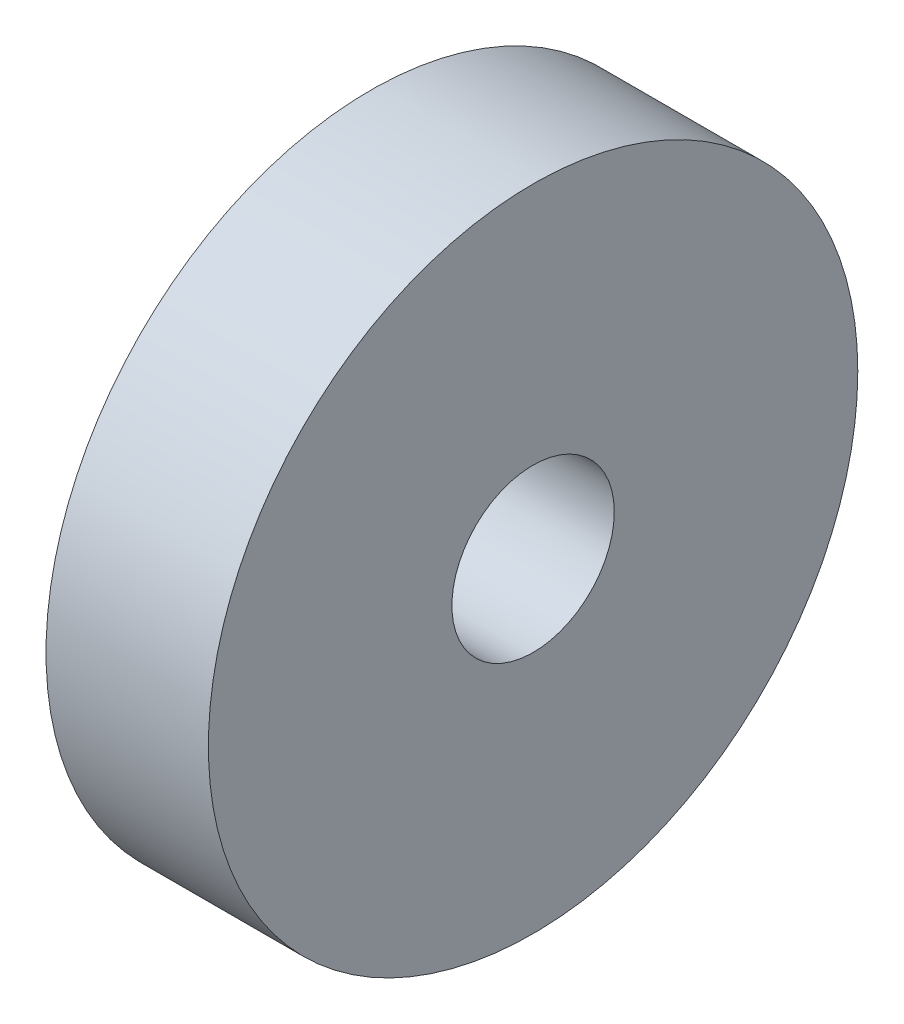
ISO-10303-21;
HEADER;
FILE_DESCRIPTION(('STEP AP214'),'2;1');
FILE_NAME('part.step','',(''),(''),'','','');
FILE_SCHEMA(('AUTOMOTIVE_DESIGN { 1 0 10303 214 1 1 1 1 }'));
ENDSEC;
DATA;
#1=APPLICATION_CONTEXT('core data for automotive mechanical design processes');
#2=APPLICATION_PROTOCOL_DEFINITION('international standard','automotive_design',2000,#1);
#3=PRODUCT_CONTEXT('',#1,'mechanical');
#4=PRODUCT('Part','Part','',(#3));
#5=PRODUCT_RELATED_PRODUCT_CATEGORY('part','',(#4));
#6=PRODUCT_DEFINITION_FORMATION('','',#4);
#7=PRODUCT_DEFINITION_CONTEXT('part definition',#1,'design');
#8=PRODUCT_DEFINITION('design','',#6,#7);
#9=PRODUCT_DEFINITION_SHAPE('','',#8);
#10=(LENGTH_UNIT() NAMED_UNIT(*) SI_UNIT(.MILLI.,.METRE.));
#11=(NAMED_UNIT(*) PLANE_ANGLE_UNIT() SI_UNIT($,.RADIAN.));
#12=(NAMED_UNIT(*) SI_UNIT($,.STERADIAN.) SOLID_ANGLE_UNIT());
#13=UNCERTAINTY_MEASURE_WITH_UNIT(LENGTH_MEASURE(1.E-05),#10,'distance_accuracy_value','');
#14=(GEOMETRIC_REPRESENTATION_CONTEXT(3) GLOBAL_UNCERTAINTY_ASSIGNED_CONTEXT((#13)) GLOBAL_UNIT_ASSIGNED_CONTEXT((#10,
#11,#12)) REPRESENTATION_CONTEXT('',''));
#15=CARTESIAN_POINT('',(0.,0.,0.));
#16=DIRECTION('',(0.,0.,1.));
#17=DIRECTION('',(1.,0.,0.));
#18=AXIS2_PLACEMENT_3D('',#15,#16,#17);
#19=CARTESIAN_POINT('',(-25.,0.,0.));
#20=DIRECTION('',(1.,0.,0.));
#21=DIRECTION('',(0.,0.,-1.));
#22=AXIS2_PLACEMENT_3D('',#19,#20,#21);
#23=CYLINDRICAL_SURFACE('',#22,100.);
#24=CARTESIAN_POINT('',(-25.,0.,0.));
#25=DIRECTION('',(1.,0.,0.));
#26=DIRECTION('',(0.,0.,-1.));
#27=AXIS2_PLACEMENT_3D('',#24,#25,#26);
#28=CIRCLE('',#27,100.);
#29=CARTESIAN_POINT('',(-25.,0.,-100.));
#30=VERTEX_POINT('',#29);
#31=EDGE_CURVE('E10',#30,#30,#28,.T.);
#32=ORIENTED_EDGE('',*,*,#31,.T.);
#33=EDGE_LOOP('',(#32));
#34=FACE_BOUND('',#33,.T.);
#35=CARTESIAN_POINT('',(25.,0.,0.));
#36=DIRECTION('',(1.,0.,0.));
#37=DIRECTION('',(0.,0.,-1.));
#38=AXIS2_PLACEMENT_3D('',#35,#36,#37);
#39=CIRCLE('',#38,100.);
#40=CARTESIAN_POINT('',(25.,0.,-100.));
#41=VERTEX_POINT('',#40);
#42=EDGE_CURVE('E45',#41,#41,#39,.T.);
#43=ORIENTED_EDGE('',*,*,#42,.F.);
#44=EDGE_LOOP('',(#43));
#45=FACE_BOUND('',#44,.T.);
#46=ADVANCED_FACE('F35',(#34,#45),#23,.T.);
#47=CARTESIAN_POINT('',(-25.,0.,0.));
#48=DIRECTION('',(1.,0.,0.));
#49=DIRECTION('',(0.,0.,-1.));
#50=AXIS2_PLACEMENT_3D('',#47,#48,#49);
#51=PLANE('',#50);
#52=CARTESIAN_POINT('',(-25.,0.,0.));
#53=DIRECTION('',(1.,0.,0.));
#54=DIRECTION('',(0.,0.,-1.));
#55=AXIS2_PLACEMENT_3D('',#52,#53,#54);
#56=CIRCLE('',#55,25.);
#57=CARTESIAN_POINT('',(-25.,0.,-25.));
#58=VERTEX_POINT('',#57);
#59=EDGE_CURVE('E41',#58,#58,#56,.T.);
#60=ORIENTED_EDGE('',*,*,#59,.T.);
#61=EDGE_LOOP('',(#60));
#62=FACE_BOUND('',#61,.T.);
#63=ORIENTED_EDGE('',*,*,#31,.F.);
#64=EDGE_LOOP('',(#63));
#65=FACE_BOUND('',#64,.T.);
#66=ADVANCED_FACE('F64',(#62,#65),#51,.F.);
#67=CARTESIAN_POINT('',(-25.,0.,0.));
#68=DIRECTION('',(1.,0.,0.));
#69=DIRECTION('',(0.,0.,-1.));
#70=AXIS2_PLACEMENT_3D('',#67,#68,#69);
#71=CYLINDRICAL_SURFACE('',#70,25.);
#72=ORIENTED_EDGE('',*,*,#59,.F.);
#73=EDGE_LOOP('',(#72));
#74=FACE_BOUND('',#73,.T.);
#75=CARTESIAN_POINT('',(25.,0.,0.));
#76=DIRECTION('',(1.,0.,0.));
#77=DIRECTION('',(0.,0.,-1.));
#78=AXIS2_PLACEMENT_3D('',#75,#76,#77);
#79=CIRCLE('',#78,25.);
#80=CARTESIAN_POINT('',(25.,0.,-25.));
#81=VERTEX_POINT('',#80);
#82=EDGE_CURVE('E49',#81,#81,#79,.T.);
#83=ORIENTED_EDGE('',*,*,#82,.T.);
#84=EDGE_LOOP('',(#83));
#85=FACE_BOUND('',#84,.T.);
#86=ADVANCED_FACE('F55',(#74,#85),#71,.F.);
#87=CARTESIAN_POINT('',(25.,0.,0.));
#88=DIRECTION('',(1.,0.,0.));
#89=DIRECTION('',(0.,0.,-1.));
#90=AXIS2_PLACEMENT_3D('',#87,#88,#89);
#91=PLANE('',#90);
#92=ORIENTED_EDGE('',*,*,#42,.T.);
#93=EDGE_LOOP('',(#92));
#94=FACE_BOUND('',#93,.T.);
#95=ORIENTED_EDGE('',*,*,#82,.F.);
#96=EDGE_LOOP('',(#95));
#97=FACE_BOUND('',#96,.T.);
#98=ADVANCED_FACE('F57',(#94,#97),#91,.T.);
#99=CLOSED_SHELL('',(#46,#66,#86,#98));
#100=MANIFOLD_SOLID_BREP('B2',#99);
#101=ADVANCED_BREP_SHAPE_REPRESENTATION('',(#18,#100),#14);
#102=SHAPE_DEFINITION_REPRESENTATION(#9,#101);
ENDSEC;
END-ISO-10303-21;
